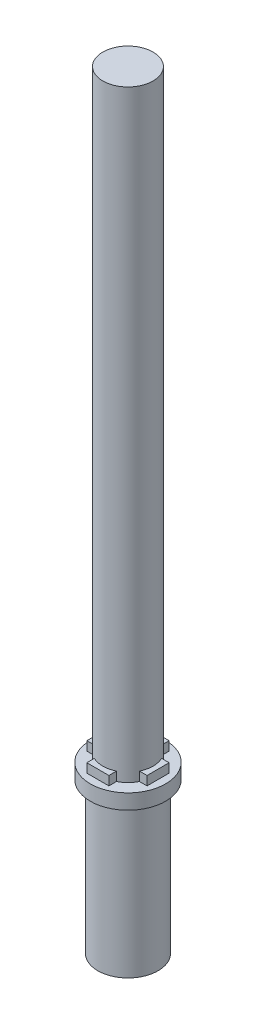
ISO-10303-21;
HEADER;
FILE_DESCRIPTION(('STEP AP214'),'2;1');
FILE_NAME('part.step','',(''),(''),'','','');
FILE_SCHEMA(('AUTOMOTIVE_DESIGN { 1 0 10303 214 1 1 1 1 }'));
ENDSEC;
DATA;
#1=APPLICATION_CONTEXT('core data for automotive mechanical design processes');
#2=APPLICATION_PROTOCOL_DEFINITION('international standard','automotive_design',2000,#1);
#3=PRODUCT_CONTEXT('',#1,'mechanical');
#4=PRODUCT('Part','Part','',(#3));
#5=PRODUCT_RELATED_PRODUCT_CATEGORY('part','',(#4));
#6=PRODUCT_DEFINITION_FORMATION('','',#4);
#7=PRODUCT_DEFINITION_CONTEXT('part definition',#1,'design');
#8=PRODUCT_DEFINITION('design','',#6,#7);
#9=PRODUCT_DEFINITION_SHAPE('','',#8);
#10=(LENGTH_UNIT() NAMED_UNIT(*) SI_UNIT(.MILLI.,.METRE.));
#11=(NAMED_UNIT(*) PLANE_ANGLE_UNIT() SI_UNIT($,.RADIAN.));
#12=(NAMED_UNIT(*) SI_UNIT($,.STERADIAN.) SOLID_ANGLE_UNIT());
#13=UNCERTAINTY_MEASURE_WITH_UNIT(LENGTH_MEASURE(1.E-05),#10,'distance_accuracy_value','');
#14=(GEOMETRIC_REPRESENTATION_CONTEXT(3) GLOBAL_UNCERTAINTY_ASSIGNED_CONTEXT((#13)) GLOBAL_UNIT_ASSIGNED_CONTEXT((#10,
#11,#12)) REPRESENTATION_CONTEXT('',''));
#15=CARTESIAN_POINT('',(0.,0.,0.));
#16=DIRECTION('',(0.,0.,1.));
#17=DIRECTION('',(1.,0.,0.));
#18=AXIS2_PLACEMENT_3D('',#15,#16,#17);
#19=CARTESIAN_POINT('',(0.,0.,0.));
#20=DIRECTION('',(0.,1.,0.));
#21=DIRECTION('',(0.,0.,1.));
#22=AXIS2_PLACEMENT_3D('',#19,#20,#21);
#23=PLANE('',#22);
#24=CARTESIAN_POINT('',(0.,0.,0.));
#25=DIRECTION('',(0.,1.,0.));
#26=DIRECTION('',(0.,0.,1.));
#27=AXIS2_PLACEMENT_3D('',#24,#25,#26);
#28=CIRCLE('',#27,6.);
#29=CARTESIAN_POINT('',(0.,0.,6.));
#30=VERTEX_POINT('',#29);
#31=EDGE_CURVE('E57',#30,#30,#28,.T.);
#32=ORIENTED_EDGE('',*,*,#31,.F.);
#33=EDGE_LOOP('',(#32));
#34=FACE_BOUND('',#33,.T.);
#35=CARTESIAN_POINT('',(0.,0.,0.));
#36=DIRECTION('',(0.,1.,0.));
#37=DIRECTION('',(0.,0.,1.));
#38=AXIS2_PLACEMENT_3D('',#35,#36,#37);
#39=CIRCLE('',#38,5.25);
#40=CARTESIAN_POINT('',(0.,0.,5.25));
#41=VERTEX_POINT('',#40);
#42=EDGE_CURVE('E352',#41,#41,#39,.T.);
#43=ORIENTED_EDGE('',*,*,#42,.T.);
#44=EDGE_LOOP('',(#43));
#45=FACE_BOUND('',#44,.T.);
#46=ADVANCED_FACE('F53',(#34,#45),#23,.F.);
#47=CARTESIAN_POINT('',(0.,30.,0.));
#48=DIRECTION('',(0.,-1.,0.));
#49=DIRECTION('',(0.,0.,-1.));
#50=AXIS2_PLACEMENT_3D('',#47,#48,#49);
#51=CYLINDRICAL_SURFACE('',#50,6.);
#52=CARTESIAN_POINT('',(0.,30.,0.));
#53=DIRECTION('',(0.,1.,0.));
#54=DIRECTION('',(0.,0.,1.));
#55=AXIS2_PLACEMENT_3D('',#52,#53,#54);
#56=CIRCLE('',#55,6.);
#57=CARTESIAN_POINT('',(0.,30.,6.));
#58=VERTEX_POINT('',#57);
#59=EDGE_CURVE('E355',#58,#58,#56,.T.);
#60=ORIENTED_EDGE('',*,*,#59,.F.);
#61=EDGE_LOOP('',(#60));
#62=FACE_BOUND('',#61,.T.);
#63=ORIENTED_EDGE('',*,*,#31,.T.);
#64=EDGE_LOOP('',(#63));
#65=FACE_BOUND('',#64,.T.);
#66=ADVANCED_FACE('F55',(#62,#65),#51,.T.);
#67=CARTESIAN_POINT('',(0.,30.,0.));
#68=DIRECTION('',(0.,-1.,0.));
#69=DIRECTION('',(0.,0.,-1.));
#70=AXIS2_PLACEMENT_3D('',#67,#68,#69);
#71=CYLINDRICAL_SURFACE('',#70,5.25);
#72=CARTESIAN_POINT('',(0.,30.,0.));
#73=DIRECTION('',(0.,1.,0.));
#74=DIRECTION('',(0.,0.,1.));
#75=AXIS2_PLACEMENT_3D('',#72,#73,#74);
#76=CIRCLE('',#75,5.25);
#77=CARTESIAN_POINT('',(0.,30.,5.25));
#78=VERTEX_POINT('',#77);
#79=EDGE_CURVE('E345',#78,#78,#76,.T.);
#80=ORIENTED_EDGE('',*,*,#79,.T.);
#81=EDGE_LOOP('',(#80));
#82=FACE_BOUND('',#81,.T.);
#83=ORIENTED_EDGE('',*,*,#42,.F.);
#84=EDGE_LOOP('',(#83));
#85=FACE_BOUND('',#84,.T.);
#86=ADVANCED_FACE('F372',(#82,#85),#71,.F.);
#87=CARTESIAN_POINT('',(0.,30.,0.));
#88=DIRECTION('',(0.,1.,0.));
#89=DIRECTION('',(0.,0.,1.));
#90=AXIS2_PLACEMENT_3D('',#87,#88,#89);
#91=PLANE('',#90);
#92=ORIENTED_EDGE('',*,*,#79,.F.);
#93=EDGE_LOOP('',(#92));
#94=FACE_BOUND('',#93,.T.);
#95=ADVANCED_FACE('F374',(#94),#91,.F.);
#96=CARTESIAN_POINT('',(0.,33.,0.));
#97=DIRECTION('',(0.,-1.,0.));
#98=DIRECTION('',(0.,0.,-1.));
#99=AXIS2_PLACEMENT_3D('',#96,#97,#98);
#100=CYLINDRICAL_SURFACE('',#99,7.5);
#101=CARTESIAN_POINT('',(0.,33.,0.));
#102=DIRECTION('',(0.,1.,0.));
#103=DIRECTION('',(0.,0.,1.));
#104=AXIS2_PLACEMENT_3D('',#101,#102,#103);
#105=CIRCLE('',#104,7.5);
#106=CARTESIAN_POINT('',(0.,33.,7.5));
#107=VERTEX_POINT('',#106);
#108=EDGE_CURVE('E341',#107,#107,#105,.T.);
#109=ORIENTED_EDGE('',*,*,#108,.F.);
#110=EDGE_LOOP('',(#109));
#111=FACE_BOUND('',#110,.T.);
#112=CARTESIAN_POINT('',(0.,30.,0.));
#113=DIRECTION('',(0.,1.,0.));
#114=DIRECTION('',(0.,0.,1.));
#115=AXIS2_PLACEMENT_3D('',#112,#113,#114);
#116=CIRCLE('',#115,7.5);
#117=CARTESIAN_POINT('',(0.,30.,7.5));
#118=VERTEX_POINT('',#117);
#119=EDGE_CURVE('E339',#118,#118,#116,.T.);
#120=ORIENTED_EDGE('',*,*,#119,.T.);
#121=EDGE_LOOP('',(#120));
#122=FACE_BOUND('',#121,.T.);
#123=ADVANCED_FACE('F381',(#111,#122),#100,.T.);
#124=CARTESIAN_POINT('',(0.,33.,0.));
#125=DIRECTION('',(0.,1.,0.));
#126=DIRECTION('',(0.,0.,1.));
#127=AXIS2_PLACEMENT_3D('',#124,#125,#126);
#128=PLANE('',#127);
#129=DIRECTION('',(-1.,0.,0.));
#130=VECTOR('',#129,1.);
#131=CARTESIAN_POINT('',(0.,33.,2.2));
#132=LINE('',#131,#130);
#133=CARTESIAN_POINT('',(6.,33.,2.2));
#134=VERTEX_POINT('',#133);
#135=CARTESIAN_POINT('',(4.48998886412873,33.,2.2));
#136=VERTEX_POINT('',#135);
#137=EDGE_CURVE('E178',#134,#136,#132,.T.);
#138=ORIENTED_EDGE('',*,*,#137,.T.);
#139=CARTESIAN_POINT('',(0.,33.,0.));
#140=DIRECTION('',(0.,1.,0.));
#141=DIRECTION('',(0.,0.,1.));
#142=AXIS2_PLACEMENT_3D('',#139,#140,#141);
#143=CIRCLE('',#142,5.);
#144=CARTESIAN_POINT('',(2.2,33.,4.48998886412873));
#145=VERTEX_POINT('',#144);
#146=EDGE_CURVE('E12',#145,#136,#143,.T.);
#147=ORIENTED_EDGE('',*,*,#146,.F.);
#148=DIRECTION('',(0.,0.,1.));
#149=VECTOR('',#148,1.);
#150=CARTESIAN_POINT('',(2.2,33.,0.));
#151=LINE('',#150,#149);
#152=CARTESIAN_POINT('',(2.2,33.,6.));
#153=VERTEX_POINT('',#152);
#154=EDGE_CURVE('E225',#145,#153,#151,.T.);
#155=ORIENTED_EDGE('',*,*,#154,.T.);
#156=DIRECTION('',(-1.,0.,0.));
#157=VECTOR('',#156,1.);
#158=CARTESIAN_POINT('',(0.,33.,6.));
#159=LINE('',#158,#157);
#160=CARTESIAN_POINT('',(-2.2,33.,6.));
#161=VERTEX_POINT('',#160);
#162=EDGE_CURVE('E239',#153,#161,#159,.T.);
#163=ORIENTED_EDGE('',*,*,#162,.T.);
#164=DIRECTION('',(0.,0.,-1.));
#165=VECTOR('',#164,1.);
#166=CARTESIAN_POINT('',(-2.2,33.,0.));
#167=LINE('',#166,#165);
#168=CARTESIAN_POINT('',(-2.2,33.,4.48998886412873));
#169=VERTEX_POINT('',#168);
#170=EDGE_CURVE('E235',#161,#169,#167,.T.);
#171=ORIENTED_EDGE('',*,*,#170,.T.);
#172=CARTESIAN_POINT('',(-4.48998886412873,33.,2.2));
#173=VERTEX_POINT('',#172);
#174=EDGE_CURVE('E65',#173,#169,#143,.T.);
#175=ORIENTED_EDGE('',*,*,#174,.F.);
#176=DIRECTION('',(-1.,0.,0.));
#177=VECTOR('',#176,1.);
#178=CARTESIAN_POINT('',(0.,33.,2.2));
#179=LINE('',#178,#177);
#180=CARTESIAN_POINT('',(-6.,33.,2.2));
#181=VERTEX_POINT('',#180);
#182=EDGE_CURVE('E303',#173,#181,#179,.T.);
#183=ORIENTED_EDGE('',*,*,#182,.T.);
#184=DIRECTION('',(0.,0.,-1.));
#185=VECTOR('',#184,1.);
#186=CARTESIAN_POINT('',(-6.,33.,0.));
#187=LINE('',#186,#185);
#188=CARTESIAN_POINT('',(-6.,33.,-2.2));
#189=VERTEX_POINT('',#188);
#190=EDGE_CURVE('E319',#181,#189,#187,.T.);
#191=ORIENTED_EDGE('',*,*,#190,.T.);
#192=DIRECTION('',(1.,0.,0.));
#193=VECTOR('',#192,1.);
#194=CARTESIAN_POINT('',(0.,33.,-2.2));
#195=LINE('',#194,#193);
#196=CARTESIAN_POINT('',(-4.48998886412873,33.,-2.2));
#197=VERTEX_POINT('',#196);
#198=EDGE_CURVE('E315',#189,#197,#195,.T.);
#199=ORIENTED_EDGE('',*,*,#198,.T.);
#200=CARTESIAN_POINT('',(-2.2,33.,-4.48998886412873));
#201=VERTEX_POINT('',#200);
#202=EDGE_CURVE('E363',#201,#197,#143,.T.);
#203=ORIENTED_EDGE('',*,*,#202,.F.);
#204=DIRECTION('',(0.,0.,-1.));
#205=VECTOR('',#204,1.);
#206=CARTESIAN_POINT('',(-2.2,33.,0.));
#207=LINE('',#206,#205);
#208=CARTESIAN_POINT('',(-2.2,33.,-6.));
#209=VERTEX_POINT('',#208);
#210=EDGE_CURVE('E263',#201,#209,#207,.T.);
#211=ORIENTED_EDGE('',*,*,#210,.T.);
#212=DIRECTION('',(1.,0.,0.));
#213=VECTOR('',#212,1.);
#214=CARTESIAN_POINT('',(0.,33.,-6.));
#215=LINE('',#214,#213);
#216=CARTESIAN_POINT('',(2.2,33.,-6.));
#217=VERTEX_POINT('',#216);
#218=EDGE_CURVE('E279',#209,#217,#215,.T.);
#219=ORIENTED_EDGE('',*,*,#218,.T.);
#220=DIRECTION('',(0.,0.,1.));
#221=VECTOR('',#220,1.);
#222=CARTESIAN_POINT('',(2.2,33.,0.));
#223=LINE('',#222,#221);
#224=CARTESIAN_POINT('',(2.2,33.,-4.48998886412873));
#225=VERTEX_POINT('',#224);
#226=EDGE_CURVE('E275',#217,#225,#223,.T.);
#227=ORIENTED_EDGE('',*,*,#226,.T.);
#228=CARTESIAN_POINT('',(4.48998886412873,33.,-2.2));
#229=VERTEX_POINT('',#228);
#230=EDGE_CURVE('E63',#229,#225,#143,.T.);
#231=ORIENTED_EDGE('',*,*,#230,.F.);
#232=DIRECTION('',(1.,0.,0.));
#233=VECTOR('',#232,1.);
#234=CARTESIAN_POINT('',(0.,33.,-2.2));
#235=LINE('',#234,#233);
#236=CARTESIAN_POINT('',(6.,33.,-2.2));
#237=VERTEX_POINT('',#236);
#238=EDGE_CURVE('E192',#229,#237,#235,.T.);
#239=ORIENTED_EDGE('',*,*,#238,.T.);
#240=DIRECTION('',(0.,0.,1.));
#241=VECTOR('',#240,1.);
#242=CARTESIAN_POINT('',(6.,33.,0.));
#243=LINE('',#242,#241);
#244=EDGE_CURVE('E205',#237,#134,#243,.T.);
#245=ORIENTED_EDGE('',*,*,#244,.T.);
#246=EDGE_LOOP('',(#138,#147,#155,#163,#171,#175,#183,#191,#199,#203,#211,#219,#227,#231,#239,#245));
#247=FACE_BOUND('',#246,.T.);
#248=ORIENTED_EDGE('',*,*,#108,.T.);
#249=EDGE_LOOP('',(#248));
#250=FACE_BOUND('',#249,.T.);
#251=ADVANCED_FACE('F388',(#247,#250),#128,.T.);
#252=ORIENTED_EDGE('',*,*,#59,.T.);
#253=EDGE_LOOP('',(#252));
#254=FACE_BOUND('',#253,.T.);
#255=ORIENTED_EDGE('',*,*,#119,.F.);
#256=EDGE_LOOP('',(#255));
#257=FACE_BOUND('',#256,.T.);
#258=ADVANCED_FACE('F384',(#254,#257),#91,.F.);
#259=CARTESIAN_POINT('',(0.,153.,0.));
#260=DIRECTION('',(0.,-1.,0.));
#261=DIRECTION('',(0.,0.,-1.));
#262=AXIS2_PLACEMENT_3D('',#259,#260,#261);
#263=CYLINDRICAL_SURFACE('',#262,5.);
#264=ORIENTED_EDGE('',*,*,#146,.T.);
#265=DIRECTION('',(0.,-1.,0.));
#266=VECTOR('',#265,1.);
#267=CARTESIAN_POINT('',(4.48998886412873,34.8,2.2));
#268=LINE('',#267,#266);
#269=CARTESIAN_POINT('',(4.48998886412873,34.8,2.2));
#270=VERTEX_POINT('',#269);
#271=EDGE_CURVE('E202',#270,#136,#268,.T.);
#272=ORIENTED_EDGE('',*,*,#271,.F.);
#273=CARTESIAN_POINT('',(0.,34.8,0.));
#274=DIRECTION('',(0.,1.,0.));
#275=DIRECTION('',(0.,0.,1.));
#276=AXIS2_PLACEMENT_3D('',#273,#274,#275);
#277=CIRCLE('',#276,5.);
#278=CARTESIAN_POINT('',(4.48998886412873,34.8,-2.2));
#279=VERTEX_POINT('',#278);
#280=EDGE_CURVE('E190',#279,#270,#277,.F.);
#281=ORIENTED_EDGE('',*,*,#280,.F.);
#282=DIRECTION('',(0.,-1.,0.));
#283=VECTOR('',#282,1.);
#284=CARTESIAN_POINT('',(4.48998886412873,34.8,-2.2));
#285=LINE('',#284,#283);
#286=EDGE_CURVE('E214',#279,#229,#285,.T.);
#287=ORIENTED_EDGE('',*,*,#286,.T.);
#288=ORIENTED_EDGE('',*,*,#230,.T.);
#289=DIRECTION('',(0.,-1.,0.));
#290=VECTOR('',#289,1.);
#291=CARTESIAN_POINT('',(2.2,34.8,-4.48998886412873));
#292=LINE('',#291,#290);
#293=CARTESIAN_POINT('',(2.2,34.8,-4.48998886412873));
#294=VERTEX_POINT('',#293);
#295=EDGE_CURVE('E274',#294,#225,#292,.T.);
#296=ORIENTED_EDGE('',*,*,#295,.F.);
#297=CARTESIAN_POINT('',(0.,34.8,0.));
#298=DIRECTION('',(0.,1.,0.));
#299=DIRECTION('',(0.,0.,1.));
#300=AXIS2_PLACEMENT_3D('',#297,#298,#299);
#301=CIRCLE('',#300,5.);
#302=CARTESIAN_POINT('',(-2.2,34.8,-4.48998886412873));
#303=VERTEX_POINT('',#302);
#304=EDGE_CURVE('E271',#303,#294,#301,.F.);
#305=ORIENTED_EDGE('',*,*,#304,.F.);
#306=DIRECTION('',(0.,-1.,0.));
#307=VECTOR('',#306,1.);
#308=CARTESIAN_POINT('',(-2.2,34.8,-4.48998886412873));
#309=LINE('',#308,#307);
#310=EDGE_CURVE('E289',#303,#201,#309,.T.);
#311=ORIENTED_EDGE('',*,*,#310,.T.);
#312=ORIENTED_EDGE('',*,*,#202,.T.);
#313=DIRECTION('',(0.,-1.,0.));
#314=VECTOR('',#313,1.);
#315=CARTESIAN_POINT('',(-4.48998886412873,34.8,-2.2));
#316=LINE('',#315,#314);
#317=CARTESIAN_POINT('',(-4.48998886412873,34.8,-2.2));
#318=VERTEX_POINT('',#317);
#319=EDGE_CURVE('E314',#318,#197,#316,.T.);
#320=ORIENTED_EDGE('',*,*,#319,.F.);
#321=CARTESIAN_POINT('',(0.,34.8,0.));
#322=DIRECTION('',(0.,1.,0.));
#323=DIRECTION('',(0.,0.,1.));
#324=AXIS2_PLACEMENT_3D('',#321,#322,#323);
#325=CIRCLE('',#324,5.);
#326=CARTESIAN_POINT('',(-4.48998886412873,34.8,2.2));
#327=VERTEX_POINT('',#326);
#328=EDGE_CURVE('E311',#327,#318,#325,.F.);
#329=ORIENTED_EDGE('',*,*,#328,.F.);
#330=DIRECTION('',(0.,-1.,0.));
#331=VECTOR('',#330,1.);
#332=CARTESIAN_POINT('',(-4.48998886412873,34.8,2.2));
#333=LINE('',#332,#331);
#334=EDGE_CURVE('E328',#327,#173,#333,.T.);
#335=ORIENTED_EDGE('',*,*,#334,.T.);
#336=ORIENTED_EDGE('',*,*,#174,.T.);
#337=DIRECTION('',(0.,-1.,0.));
#338=VECTOR('',#337,1.);
#339=CARTESIAN_POINT('',(-2.2,34.8,4.48998886412873));
#340=LINE('',#339,#338);
#341=CARTESIAN_POINT('',(-2.2,34.8,4.48998886412873));
#342=VERTEX_POINT('',#341);
#343=EDGE_CURVE('E234',#342,#169,#340,.T.);
#344=ORIENTED_EDGE('',*,*,#343,.F.);
#345=CARTESIAN_POINT('',(0.,34.8,0.));
#346=DIRECTION('',(0.,1.,0.));
#347=DIRECTION('',(0.,0.,1.));
#348=AXIS2_PLACEMENT_3D('',#345,#346,#347);
#349=CIRCLE('',#348,5.);
#350=CARTESIAN_POINT('',(2.2,34.8,4.48998886412873));
#351=VERTEX_POINT('',#350);
#352=EDGE_CURVE('E231',#351,#342,#349,.F.);
#353=ORIENTED_EDGE('',*,*,#352,.F.);
#354=DIRECTION('',(0.,-1.,0.));
#355=VECTOR('',#354,1.);
#356=CARTESIAN_POINT('',(2.2,34.8,4.48998886412873));
#357=LINE('',#356,#355);
#358=EDGE_CURVE('E249',#351,#145,#357,.T.);
#359=ORIENTED_EDGE('',*,*,#358,.T.);
#360=EDGE_LOOP('',(#264,#272,#281,#287,#288,#296,#305,#311,#312,#320,#329,#335,#336,#344,#353,#359));
#361=FACE_BOUND('',#360,.T.);
#362=CARTESIAN_POINT('',(0.,153.,0.));
#363=DIRECTION('',(0.,1.,0.));
#364=DIRECTION('',(0.,0.,1.));
#365=AXIS2_PLACEMENT_3D('',#362,#363,#364);
#366=CIRCLE('',#365,5.);
#367=CARTESIAN_POINT('',(0.,153.,5.));
#368=VERTEX_POINT('',#367);
#369=EDGE_CURVE('E184',#368,#368,#366,.T.);
#370=ORIENTED_EDGE('',*,*,#369,.F.);
#371=EDGE_LOOP('',(#370));
#372=FACE_BOUND('',#371,.T.);
#373=ADVANCED_FACE('F392',(#361,#372),#263,.T.);
#374=CARTESIAN_POINT('',(0.,153.,0.));
#375=DIRECTION('',(0.,1.,0.));
#376=DIRECTION('',(0.,0.,1.));
#377=AXIS2_PLACEMENT_3D('',#374,#375,#376);
#378=PLANE('',#377);
#379=ORIENTED_EDGE('',*,*,#369,.T.);
#380=EDGE_LOOP('',(#379));
#381=FACE_BOUND('',#380,.T.);
#382=ADVANCED_FACE('F398',(#381),#378,.T.);
#383=CARTESIAN_POINT('',(0.,34.8,-2.2));
#384=DIRECTION('',(0.,0.,-1.));
#385=DIRECTION('',(-1.,0.,0.));
#386=AXIS2_PLACEMENT_3D('',#383,#384,#385);
#387=PLANE('',#386);
#388=ORIENTED_EDGE('',*,*,#198,.F.);
#389=DIRECTION('',(0.,-1.,0.));
#390=VECTOR('',#389,1.);
#391=CARTESIAN_POINT('',(-6.,34.8,-2.2));
#392=LINE('',#391,#390);
#393=CARTESIAN_POINT('',(-6.,34.8,-2.2));
#394=VERTEX_POINT('',#393);
#395=EDGE_CURVE('E280',#394,#189,#392,.T.);
#396=ORIENTED_EDGE('',*,*,#395,.F.);
#397=DIRECTION('',(1.,0.,0.));
#398=VECTOR('',#397,1.);
#399=CARTESIAN_POINT('',(0.,34.8,-2.2));
#400=LINE('',#399,#398);
#401=EDGE_CURVE('E298',#394,#318,#400,.T.);
#402=ORIENTED_EDGE('',*,*,#401,.T.);
#403=ORIENTED_EDGE('',*,*,#319,.T.);
#404=EDGE_LOOP('',(#388,#396,#402,#403));
#405=FACE_BOUND('',#404,.T.);
#406=ADVANCED_FACE('F402',(#405),#387,.T.);
#407=CARTESIAN_POINT('',(-6.,34.8,0.));
#408=DIRECTION('',(-1.,0.,0.));
#409=DIRECTION('',(0.,0.,1.));
#410=AXIS2_PLACEMENT_3D('',#407,#408,#409);
#411=PLANE('',#410);
#412=ORIENTED_EDGE('',*,*,#190,.F.);
#413=DIRECTION('',(0.,-1.,0.));
#414=VECTOR('',#413,1.);
#415=CARTESIAN_POINT('',(-6.,34.8,2.2));
#416=LINE('',#415,#414);
#417=CARTESIAN_POINT('',(-6.,34.8,2.2));
#418=VERTEX_POINT('',#417);
#419=EDGE_CURVE('E332',#418,#181,#416,.T.);
#420=ORIENTED_EDGE('',*,*,#419,.F.);
#421=DIRECTION('',(0.,0.,-1.));
#422=VECTOR('',#421,1.);
#423=CARTESIAN_POINT('',(-6.,34.8,0.));
#424=LINE('',#423,#422);
#425=EDGE_CURVE('E302',#418,#394,#424,.T.);
#426=ORIENTED_EDGE('',*,*,#425,.T.);
#427=ORIENTED_EDGE('',*,*,#395,.T.);
#428=EDGE_LOOP('',(#412,#420,#426,#427));
#429=FACE_BOUND('',#428,.T.);
#430=ADVANCED_FACE('F406',(#429),#411,.T.);
#431=CARTESIAN_POINT('',(0.,34.8,2.2));
#432=DIRECTION('',(0.,0.,1.));
#433=DIRECTION('',(1.,0.,0.));
#434=AXIS2_PLACEMENT_3D('',#431,#432,#433);
#435=PLANE('',#434);
#436=ORIENTED_EDGE('',*,*,#182,.F.);
#437=ORIENTED_EDGE('',*,*,#334,.F.);
#438=DIRECTION('',(-1.,0.,0.));
#439=VECTOR('',#438,1.);
#440=CARTESIAN_POINT('',(0.,34.8,2.2));
#441=LINE('',#440,#439);
#442=EDGE_CURVE('E307',#327,#418,#441,.T.);
#443=ORIENTED_EDGE('',*,*,#442,.T.);
#444=ORIENTED_EDGE('',*,*,#419,.T.);
#445=EDGE_LOOP('',(#436,#437,#443,#444));
#446=FACE_BOUND('',#445,.T.);
#447=ADVANCED_FACE('F410',(#446),#435,.T.);
#448=CARTESIAN_POINT('',(0.,34.8,0.));
#449=DIRECTION('',(0.,1.,0.));
#450=DIRECTION('',(0.,0.,1.));
#451=AXIS2_PLACEMENT_3D('',#448,#449,#450);
#452=PLANE('',#451);
#453=ORIENTED_EDGE('',*,*,#401,.F.);
#454=ORIENTED_EDGE('',*,*,#425,.F.);
#455=ORIENTED_EDGE('',*,*,#442,.F.);
#456=ORIENTED_EDGE('',*,*,#328,.T.);
#457=EDGE_LOOP('',(#453,#454,#455,#456));
#458=FACE_BOUND('',#457,.T.);
#459=ADVANCED_FACE('F414',(#458),#452,.T.);
#460=CARTESIAN_POINT('',(2.2,34.8,0.));
#461=DIRECTION('',(1.,0.,0.));
#462=DIRECTION('',(0.,0.,-1.));
#463=AXIS2_PLACEMENT_3D('',#460,#461,#462);
#464=PLANE('',#463);
#465=ORIENTED_EDGE('',*,*,#226,.F.);
#466=DIRECTION('',(0.,-1.,0.));
#467=VECTOR('',#466,1.);
#468=CARTESIAN_POINT('',(2.2,34.8,-6.));
#469=LINE('',#468,#467);
#470=CARTESIAN_POINT('',(2.2,34.8,-6.));
#471=VERTEX_POINT('',#470);
#472=EDGE_CURVE('E240',#471,#217,#469,.T.);
#473=ORIENTED_EDGE('',*,*,#472,.F.);
#474=DIRECTION('',(0.,0.,1.));
#475=VECTOR('',#474,1.);
#476=CARTESIAN_POINT('',(2.2,34.8,0.));
#477=LINE('',#476,#475);
#478=EDGE_CURVE('E258',#471,#294,#477,.T.);
#479=ORIENTED_EDGE('',*,*,#478,.T.);
#480=ORIENTED_EDGE('',*,*,#295,.T.);
#481=EDGE_LOOP('',(#465,#473,#479,#480));
#482=FACE_BOUND('',#481,.T.);
#483=ADVANCED_FACE('F418',(#482),#464,.T.);
#484=CARTESIAN_POINT('',(0.,34.8,-6.));
#485=DIRECTION('',(0.,0.,-1.));
#486=DIRECTION('',(-1.,0.,0.));
#487=AXIS2_PLACEMENT_3D('',#484,#485,#486);
#488=PLANE('',#487);
#489=ORIENTED_EDGE('',*,*,#218,.F.);
#490=DIRECTION('',(0.,-1.,0.));
#491=VECTOR('',#490,1.);
#492=CARTESIAN_POINT('',(-2.2,34.8,-6.));
#493=LINE('',#492,#491);
#494=CARTESIAN_POINT('',(-2.2,34.8,-6.));
#495=VERTEX_POINT('',#494);
#496=EDGE_CURVE('E293',#495,#209,#493,.T.);
#497=ORIENTED_EDGE('',*,*,#496,.F.);
#498=DIRECTION('',(1.,0.,0.));
#499=VECTOR('',#498,1.);
#500=CARTESIAN_POINT('',(0.,34.8,-6.));
#501=LINE('',#500,#499);
#502=EDGE_CURVE('E262',#495,#471,#501,.T.);
#503=ORIENTED_EDGE('',*,*,#502,.T.);
#504=ORIENTED_EDGE('',*,*,#472,.T.);
#505=EDGE_LOOP('',(#489,#497,#503,#504));
#506=FACE_BOUND('',#505,.T.);
#507=ADVANCED_FACE('F422',(#506),#488,.T.);
#508=CARTESIAN_POINT('',(-2.2,34.8,0.));
#509=DIRECTION('',(-1.,0.,0.));
#510=DIRECTION('',(0.,0.,1.));
#511=AXIS2_PLACEMENT_3D('',#508,#509,#510);
#512=PLANE('',#511);
#513=ORIENTED_EDGE('',*,*,#210,.F.);
#514=ORIENTED_EDGE('',*,*,#310,.F.);
#515=DIRECTION('',(0.,0.,-1.));
#516=VECTOR('',#515,1.);
#517=CARTESIAN_POINT('',(-2.2,34.8,0.));
#518=LINE('',#517,#516);
#519=EDGE_CURVE('E267',#303,#495,#518,.T.);
#520=ORIENTED_EDGE('',*,*,#519,.T.);
#521=ORIENTED_EDGE('',*,*,#496,.T.);
#522=EDGE_LOOP('',(#513,#514,#520,#521));
#523=FACE_BOUND('',#522,.T.);
#524=ADVANCED_FACE('F426',(#523),#512,.T.);
#525=CARTESIAN_POINT('',(0.,34.8,0.));
#526=DIRECTION('',(0.,1.,0.));
#527=DIRECTION('',(0.,0.,1.));
#528=AXIS2_PLACEMENT_3D('',#525,#526,#527);
#529=PLANE('',#528);
#530=ORIENTED_EDGE('',*,*,#478,.F.);
#531=ORIENTED_EDGE('',*,*,#502,.F.);
#532=ORIENTED_EDGE('',*,*,#519,.F.);
#533=ORIENTED_EDGE('',*,*,#304,.T.);
#534=EDGE_LOOP('',(#530,#531,#532,#533));
#535=FACE_BOUND('',#534,.T.);
#536=ADVANCED_FACE('F430',(#535),#529,.T.);
#537=CARTESIAN_POINT('',(-2.2,34.8,0.));
#538=DIRECTION('',(-1.,0.,0.));
#539=DIRECTION('',(0.,0.,1.));
#540=AXIS2_PLACEMENT_3D('',#537,#538,#539);
#541=PLANE('',#540);
#542=ORIENTED_EDGE('',*,*,#170,.F.);
#543=DIRECTION('',(0.,-1.,0.));
#544=VECTOR('',#543,1.);
#545=CARTESIAN_POINT('',(-2.2,34.8,6.));
#546=LINE('',#545,#544);
#547=CARTESIAN_POINT('',(-2.2,34.8,6.));
#548=VERTEX_POINT('',#547);
#549=EDGE_CURVE('E206',#548,#161,#546,.T.);
#550=ORIENTED_EDGE('',*,*,#549,.F.);
#551=DIRECTION('',(0.,0.,-1.));
#552=VECTOR('',#551,1.);
#553=CARTESIAN_POINT('',(-2.2,34.8,0.));
#554=LINE('',#553,#552);
#555=EDGE_CURVE('E220',#548,#342,#554,.T.);
#556=ORIENTED_EDGE('',*,*,#555,.T.);
#557=ORIENTED_EDGE('',*,*,#343,.T.);
#558=EDGE_LOOP('',(#542,#550,#556,#557));
#559=FACE_BOUND('',#558,.T.);
#560=ADVANCED_FACE('F434',(#559),#541,.T.);
#561=CARTESIAN_POINT('',(0.,34.8,6.));
#562=DIRECTION('',(0.,0.,1.));
#563=DIRECTION('',(1.,0.,0.));
#564=AXIS2_PLACEMENT_3D('',#561,#562,#563);
#565=PLANE('',#564);
#566=ORIENTED_EDGE('',*,*,#162,.F.);
#567=DIRECTION('',(0.,-1.,0.));
#568=VECTOR('',#567,1.);
#569=CARTESIAN_POINT('',(2.2,34.8,6.));
#570=LINE('',#569,#568);
#571=CARTESIAN_POINT('',(2.2,34.8,6.));
#572=VERTEX_POINT('',#571);
#573=EDGE_CURVE('E253',#572,#153,#570,.T.);
#574=ORIENTED_EDGE('',*,*,#573,.F.);
#575=DIRECTION('',(-1.,0.,0.));
#576=VECTOR('',#575,1.);
#577=CARTESIAN_POINT('',(0.,34.8,6.));
#578=LINE('',#577,#576);
#579=EDGE_CURVE('E224',#572,#548,#578,.T.);
#580=ORIENTED_EDGE('',*,*,#579,.T.);
#581=ORIENTED_EDGE('',*,*,#549,.T.);
#582=EDGE_LOOP('',(#566,#574,#580,#581));
#583=FACE_BOUND('',#582,.T.);
#584=ADVANCED_FACE('F438',(#583),#565,.T.);
#585=CARTESIAN_POINT('',(2.2,34.8,0.));
#586=DIRECTION('',(1.,0.,0.));
#587=DIRECTION('',(0.,0.,-1.));
#588=AXIS2_PLACEMENT_3D('',#585,#586,#587);
#589=PLANE('',#588);
#590=ORIENTED_EDGE('',*,*,#154,.F.);
#591=ORIENTED_EDGE('',*,*,#358,.F.);
#592=DIRECTION('',(0.,0.,1.));
#593=VECTOR('',#592,1.);
#594=CARTESIAN_POINT('',(2.2,34.8,0.));
#595=LINE('',#594,#593);
#596=EDGE_CURVE('E80',#351,#572,#595,.T.);
#597=ORIENTED_EDGE('',*,*,#596,.T.);
#598=ORIENTED_EDGE('',*,*,#573,.T.);
#599=EDGE_LOOP('',(#590,#591,#597,#598));
#600=FACE_BOUND('',#599,.T.);
#601=ADVANCED_FACE('F442',(#600),#589,.T.);
#602=CARTESIAN_POINT('',(0.,34.8,0.));
#603=DIRECTION('',(0.,1.,0.));
#604=DIRECTION('',(0.,0.,1.));
#605=AXIS2_PLACEMENT_3D('',#602,#603,#604);
#606=PLANE('',#605);
#607=ORIENTED_EDGE('',*,*,#555,.F.);
#608=ORIENTED_EDGE('',*,*,#579,.F.);
#609=ORIENTED_EDGE('',*,*,#596,.F.);
#610=ORIENTED_EDGE('',*,*,#352,.T.);
#611=EDGE_LOOP('',(#607,#608,#609,#610));
#612=FACE_BOUND('',#611,.T.);
#613=ADVANCED_FACE('F446',(#612),#606,.T.);
#614=CARTESIAN_POINT('',(0.,34.8,2.2));
#615=DIRECTION('',(0.,0.,1.));
#616=DIRECTION('',(1.,0.,0.));
#617=AXIS2_PLACEMENT_3D('',#614,#615,#616);
#618=PLANE('',#617);
#619=ORIENTED_EDGE('',*,*,#137,.F.);
#620=DIRECTION('',(0.,-1.,0.));
#621=VECTOR('',#620,1.);
#622=CARTESIAN_POINT('',(6.,34.8,2.2));
#623=LINE('',#622,#621);
#624=CARTESIAN_POINT('',(6.,34.8,2.2));
#625=VERTEX_POINT('',#624);
#626=EDGE_CURVE('E172',#625,#134,#623,.T.);
#627=ORIENTED_EDGE('',*,*,#626,.F.);
#628=DIRECTION('',(-1.,0.,0.));
#629=VECTOR('',#628,1.);
#630=CARTESIAN_POINT('',(0.,34.8,2.2));
#631=LINE('',#630,#629);
#632=EDGE_CURVE('E175',#625,#270,#631,.T.);
#633=ORIENTED_EDGE('',*,*,#632,.T.);
#634=ORIENTED_EDGE('',*,*,#271,.T.);
#635=EDGE_LOOP('',(#619,#627,#633,#634));
#636=FACE_BOUND('',#635,.T.);
#637=ADVANCED_FACE('F174',(#636),#618,.T.);
#638=CARTESIAN_POINT('',(6.,34.8,0.));
#639=DIRECTION('',(1.,0.,0.));
#640=DIRECTION('',(0.,0.,-1.));
#641=AXIS2_PLACEMENT_3D('',#638,#639,#640);
#642=PLANE('',#641);
#643=ORIENTED_EDGE('',*,*,#244,.F.);
#644=DIRECTION('',(0.,-1.,0.));
#645=VECTOR('',#644,1.);
#646=CARTESIAN_POINT('',(6.,34.8,-2.2));
#647=LINE('',#646,#645);
#648=CARTESIAN_POINT('',(6.,34.8,-2.2));
#649=VERTEX_POINT('',#648);
#650=EDGE_CURVE('E185',#649,#237,#647,.T.);
#651=ORIENTED_EDGE('',*,*,#650,.F.);
#652=DIRECTION('',(0.,0.,1.));
#653=VECTOR('',#652,1.);
#654=CARTESIAN_POINT('',(6.,34.8,0.));
#655=LINE('',#654,#653);
#656=EDGE_CURVE('E188',#649,#625,#655,.T.);
#657=ORIENTED_EDGE('',*,*,#656,.T.);
#658=ORIENTED_EDGE('',*,*,#626,.T.);
#659=EDGE_LOOP('',(#643,#651,#657,#658));
#660=FACE_BOUND('',#659,.T.);
#661=ADVANCED_FACE('F194',(#660),#642,.T.);
#662=CARTESIAN_POINT('',(0.,34.8,-2.2));
#663=DIRECTION('',(0.,0.,-1.));
#664=DIRECTION('',(-1.,0.,0.));
#665=AXIS2_PLACEMENT_3D('',#662,#663,#664);
#666=PLANE('',#665);
#667=ORIENTED_EDGE('',*,*,#238,.F.);
#668=ORIENTED_EDGE('',*,*,#286,.F.);
#669=DIRECTION('',(1.,0.,0.));
#670=VECTOR('',#669,1.);
#671=CARTESIAN_POINT('',(0.,34.8,-2.2));
#672=LINE('',#671,#670);
#673=EDGE_CURVE('E72',#279,#649,#672,.T.);
#674=ORIENTED_EDGE('',*,*,#673,.T.);
#675=ORIENTED_EDGE('',*,*,#650,.T.);
#676=EDGE_LOOP('',(#667,#668,#674,#675));
#677=FACE_BOUND('',#676,.T.);
#678=ADVANCED_FACE('F454',(#677),#666,.T.);
#679=CARTESIAN_POINT('',(0.,34.8,0.));
#680=DIRECTION('',(0.,1.,0.));
#681=DIRECTION('',(0.,0.,1.));
#682=AXIS2_PLACEMENT_3D('',#679,#680,#681);
#683=PLANE('',#682);
#684=ORIENTED_EDGE('',*,*,#632,.F.);
#685=ORIENTED_EDGE('',*,*,#656,.F.);
#686=ORIENTED_EDGE('',*,*,#673,.F.);
#687=ORIENTED_EDGE('',*,*,#280,.T.);
#688=EDGE_LOOP('',(#684,#685,#686,#687));
#689=FACE_BOUND('',#688,.T.);
#690=ADVANCED_FACE('F187',(#689),#683,.T.);
#691=CLOSED_SHELL('',(#46,#66,#86,#95,#123,#251,#258,#373,#382,#406,#430,#447,#459,#483,#507,
#524,#536,#560,#584,#601,#613,#637,#661,#678,#690));
#692=MANIFOLD_SOLID_BREP('B2',#691);
#693=ADVANCED_BREP_SHAPE_REPRESENTATION('',(#18,#692),#14);
#694=SHAPE_DEFINITION_REPRESENTATION(#9,#693);
ENDSEC;
END-ISO-10303-21;
